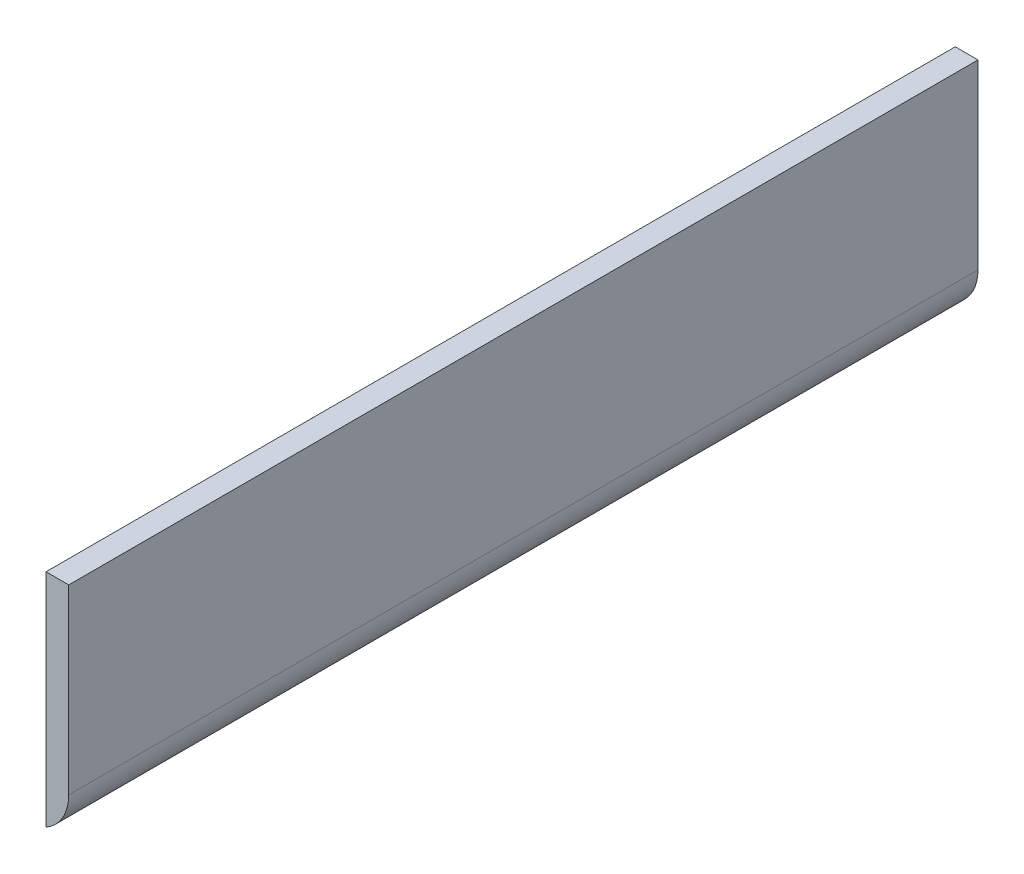
ISO-10303-21;
HEADER;
FILE_DESCRIPTION(('STEP AP214'),'2;1');
FILE_NAME('part.step','',(''),(''),'','','');
FILE_SCHEMA(('AUTOMOTIVE_DESIGN { 1 0 10303 214 1 1 1 1 }'));
ENDSEC;
DATA;
#1=APPLICATION_CONTEXT('core data for automotive mechanical design processes');
#2=APPLICATION_PROTOCOL_DEFINITION('international standard','automotive_design',2000,#1);
#3=PRODUCT_CONTEXT('',#1,'mechanical');
#4=PRODUCT('Part','Part','',(#3));
#5=PRODUCT_RELATED_PRODUCT_CATEGORY('part','',(#4));
#6=PRODUCT_DEFINITION_FORMATION('','',#4);
#7=PRODUCT_DEFINITION_CONTEXT('part definition',#1,'design');
#8=PRODUCT_DEFINITION('design','',#6,#7);
#9=PRODUCT_DEFINITION_SHAPE('','',#8);
#10=(LENGTH_UNIT() NAMED_UNIT(*) SI_UNIT(.MILLI.,.METRE.));
#11=(NAMED_UNIT(*) PLANE_ANGLE_UNIT() SI_UNIT($,.RADIAN.));
#12=(NAMED_UNIT(*) SI_UNIT($,.STERADIAN.) SOLID_ANGLE_UNIT());
#13=UNCERTAINTY_MEASURE_WITH_UNIT(LENGTH_MEASURE(1.E-05),#10,'distance_accuracy_value','');
#14=(GEOMETRIC_REPRESENTATION_CONTEXT(3) GLOBAL_UNCERTAINTY_ASSIGNED_CONTEXT((#13)) GLOBAL_UNIT_ASSIGNED_CONTEXT((#10,
#11,#12)) REPRESENTATION_CONTEXT('',''));
#15=CARTESIAN_POINT('',(0.,0.,0.));
#16=DIRECTION('',(0.,0.,1.));
#17=DIRECTION('',(1.,0.,0.));
#18=AXIS2_PLACEMENT_3D('',#15,#16,#17);
#19=CARTESIAN_POINT('',(1167.,870.,-830.));
#20=DIRECTION('',(-1.,0.,0.));
#21=DIRECTION('',(0.,-1.,0.));
#22=AXIS2_PLACEMENT_3D('',#19,#20,#21);
#23=PLANE('',#22);
#24=DIRECTION('',(0.,-1.,0.));
#25=VECTOR('',#24,1.);
#26=CARTESIAN_POINT('',(1167.,-789.500000000002,-340.000000000001));
#27=LINE('',#26,#25);
#28=CARTESIAN_POINT('',(1167.,-776.500000000002,-340.000000000001));
#29=VERTEX_POINT('',#28);
#30=CARTESIAN_POINT('',(1167.,-791.098076211356,-340.000000000001));
#31=VERTEX_POINT('',#30);
#32=EDGE_CURVE('E91',#29,#31,#27,.T.);
#33=ORIENTED_EDGE('',*,*,#32,.F.);
#34=DIRECTION('',(0.,0.,-1.));
#35=VECTOR('',#34,1.);
#36=CARTESIAN_POINT('',(1167.,-776.500000000002,-400.000000000001));
#37=LINE('',#36,#35);
#38=CARTESIAN_POINT('',(1167.,-776.500000000002,-400.000000000001));
#39=VERTEX_POINT('',#38);
#40=EDGE_CURVE('E96',#29,#39,#37,.T.);
#41=ORIENTED_EDGE('',*,*,#40,.T.);
#42=DIRECTION('',(0.,1.,0.));
#43=VECTOR('',#42,1.);
#44=CARTESIAN_POINT('',(1167.,-789.500000000002,-400.000000000001));
#45=LINE('',#44,#43);
#46=CARTESIAN_POINT('',(1167.,-791.098076211356,-400.000000000001));
#47=VERTEX_POINT('',#46);
#48=EDGE_CURVE('E102',#47,#39,#45,.T.);
#49=ORIENTED_EDGE('',*,*,#48,.F.);
#50=DIRECTION('',(0.,0.,1.));
#51=VECTOR('',#50,1.);
#52=CARTESIAN_POINT('',(1167.,-791.098076211356,-340.000000000001));
#53=LINE('',#52,#51);
#54=EDGE_CURVE('E72',#31,#47,#53,.F.);
#55=ORIENTED_EDGE('',*,*,#54,.F.);
#56=EDGE_LOOP('',(#33,#41,#49,#55));
#57=FACE_BOUND('',#56,.T.);
#58=ADVANCED_FACE('F37',(#57),#23,.T.);
#59=CARTESIAN_POINT('',(1144.5,-789.500000000002,-340.000000000001));
#60=DIRECTION('',(0.,0.,1.));
#61=DIRECTION('',(0.,-1.,0.));
#62=AXIS2_PLACEMENT_3D('',#59,#60,#61);
#63=PLANE('',#62);
#64=DIRECTION('',(1.,0.,0.));
#65=VECTOR('',#64,1.);
#66=CARTESIAN_POINT('',(1144.5,-776.500000000002,-340.000000000001));
#67=LINE('',#66,#65);
#68=CARTESIAN_POINT('',(1168.5,-776.500000000002,-340.000000000001));
#69=VERTEX_POINT('',#68);
#70=EDGE_CURVE('E89',#69,#29,#67,.F.);
#71=ORIENTED_EDGE('',*,*,#70,.T.);
#72=ORIENTED_EDGE('',*,*,#32,.T.);
#73=CARTESIAN_POINT('',(1165.5,-788.500000000001,-340.000000000001));
#74=DIRECTION('',(0.,0.,1.));
#75=DIRECTION('',(0.,-1.,0.));
#76=AXIS2_PLACEMENT_3D('',#73,#74,#75);
#77=CIRCLE('',#76,2.99999999999989);
#78=CARTESIAN_POINT('',(1168.5,-788.500000000001,-340.000000000001));
#79=VERTEX_POINT('',#78);
#80=EDGE_CURVE('E85',#79,#31,#77,.F.);
#81=ORIENTED_EDGE('',*,*,#80,.F.);
#82=DIRECTION('',(0.,-1.,0.));
#83=VECTOR('',#82,1.);
#84=CARTESIAN_POINT('',(1168.5,-789.500000000002,-340.000000000001));
#85=LINE('',#84,#83);
#86=EDGE_CURVE('E80',#79,#69,#85,.F.);
#87=ORIENTED_EDGE('',*,*,#86,.T.);
#88=EDGE_LOOP('',(#71,#72,#81,#87));
#89=FACE_BOUND('',#88,.T.);
#90=ADVANCED_FACE('F88',(#89),#63,.T.);
#91=CARTESIAN_POINT('',(1168.5,-791.500000000002,-370.000000000001));
#92=DIRECTION('',(-1.,0.,0.));
#93=DIRECTION('',(0.,-1.,0.));
#94=AXIS2_PLACEMENT_3D('',#91,#92,#93);
#95=PLANE('',#94);
#96=DIRECTION('',(0.,0.,1.));
#97=VECTOR('',#96,1.);
#98=CARTESIAN_POINT('',(1168.5,-776.500000000002,-370.000000000001));
#99=LINE('',#98,#97);
#100=CARTESIAN_POINT('',(1168.5,-776.500000000002,-400.000000000001));
#101=VERTEX_POINT('',#100);
#102=EDGE_CURVE('E40',#69,#101,#99,.F.);
#103=ORIENTED_EDGE('',*,*,#102,.F.);
#104=ORIENTED_EDGE('',*,*,#86,.F.);
#105=DIRECTION('',(0.,0.,1.));
#106=VECTOR('',#105,1.);
#107=CARTESIAN_POINT('',(1168.5,-788.500000000001,-340.000000000001));
#108=LINE('',#107,#106);
#109=CARTESIAN_POINT('',(1168.5,-788.500000000001,-400.000000000001));
#110=VERTEX_POINT('',#109);
#111=EDGE_CURVE('E105',#110,#79,#108,.T.);
#112=ORIENTED_EDGE('',*,*,#111,.F.);
#113=DIRECTION('',(0.,1.,0.));
#114=VECTOR('',#113,1.);
#115=CARTESIAN_POINT('',(1168.5,-789.500000000002,-400.000000000001));
#116=LINE('',#115,#114);
#117=EDGE_CURVE('E11',#101,#110,#116,.F.);
#118=ORIENTED_EDGE('',*,*,#117,.F.);
#119=EDGE_LOOP('',(#103,#104,#112,#118));
#120=FACE_BOUND('',#119,.T.);
#121=ADVANCED_FACE('F79',(#120),#95,.F.);
#122=CARTESIAN_POINT('',(1168.5,-776.500000000002,-400.000000000001));
#123=DIRECTION('',(0.,-1.,0.));
#124=DIRECTION('',(0.,0.,-1.));
#125=AXIS2_PLACEMENT_3D('',#122,#123,#124);
#126=PLANE('',#125);
#127=ORIENTED_EDGE('',*,*,#40,.F.);
#128=ORIENTED_EDGE('',*,*,#70,.F.);
#129=ORIENTED_EDGE('',*,*,#102,.T.);
#130=DIRECTION('',(1.,0.,0.));
#131=VECTOR('',#130,1.);
#132=CARTESIAN_POINT('',(1144.5,-776.500000000002,-400.000000000001));
#133=LINE('',#132,#131);
#134=EDGE_CURVE('E46',#39,#101,#133,.T.);
#135=ORIENTED_EDGE('',*,*,#134,.F.);
#136=EDGE_LOOP('',(#127,#128,#129,#135));
#137=FACE_BOUND('',#136,.T.);
#138=ADVANCED_FACE('F94',(#137),#126,.F.);
#139=CARTESIAN_POINT('',(1165.5,-788.500000000001,-340.000000000001));
#140=DIRECTION('',(0.,0.,1.));
#141=DIRECTION('',(0.,-1.,0.));
#142=AXIS2_PLACEMENT_3D('',#139,#140,#141);
#143=CYLINDRICAL_SURFACE('',#142,2.99999999999989);
#144=ORIENTED_EDGE('',*,*,#80,.T.);
#145=ORIENTED_EDGE('',*,*,#54,.T.);
#146=CARTESIAN_POINT('',(1165.5,-788.500000000001,-400.000000000001));
#147=DIRECTION('',(0.,0.,1.));
#148=DIRECTION('',(0.,-1.,0.));
#149=AXIS2_PLACEMENT_3D('',#146,#147,#148);
#150=CIRCLE('',#149,2.99999999999989);
#151=EDGE_CURVE('E104',#110,#47,#150,.F.);
#152=ORIENTED_EDGE('',*,*,#151,.F.);
#153=ORIENTED_EDGE('',*,*,#111,.T.);
#154=EDGE_LOOP('',(#144,#145,#152,#153));
#155=FACE_BOUND('',#154,.T.);
#156=ADVANCED_FACE('F110',(#155),#143,.T.);
#157=CARTESIAN_POINT('',(1144.5,-789.500000000002,-400.000000000001));
#158=DIRECTION('',(0.,0.,-1.));
#159=DIRECTION('',(0.,1.,0.));
#160=AXIS2_PLACEMENT_3D('',#157,#158,#159);
#161=PLANE('',#160);
#162=ORIENTED_EDGE('',*,*,#151,.T.);
#163=ORIENTED_EDGE('',*,*,#48,.T.);
#164=ORIENTED_EDGE('',*,*,#134,.T.);
#165=ORIENTED_EDGE('',*,*,#117,.T.);
#166=EDGE_LOOP('',(#162,#163,#164,#165));
#167=FACE_BOUND('',#166,.T.);
#168=ADVANCED_FACE('F111',(#167),#161,.T.);
#169=CLOSED_SHELL('',(#58,#90,#121,#138,#156,#168));
#170=MANIFOLD_SOLID_BREP('B2',#169);
#171=ADVANCED_BREP_SHAPE_REPRESENTATION('',(#18,#170),#14);
#172=SHAPE_DEFINITION_REPRESENTATION(#9,#171);
ENDSEC;
END-ISO-10303-21;
